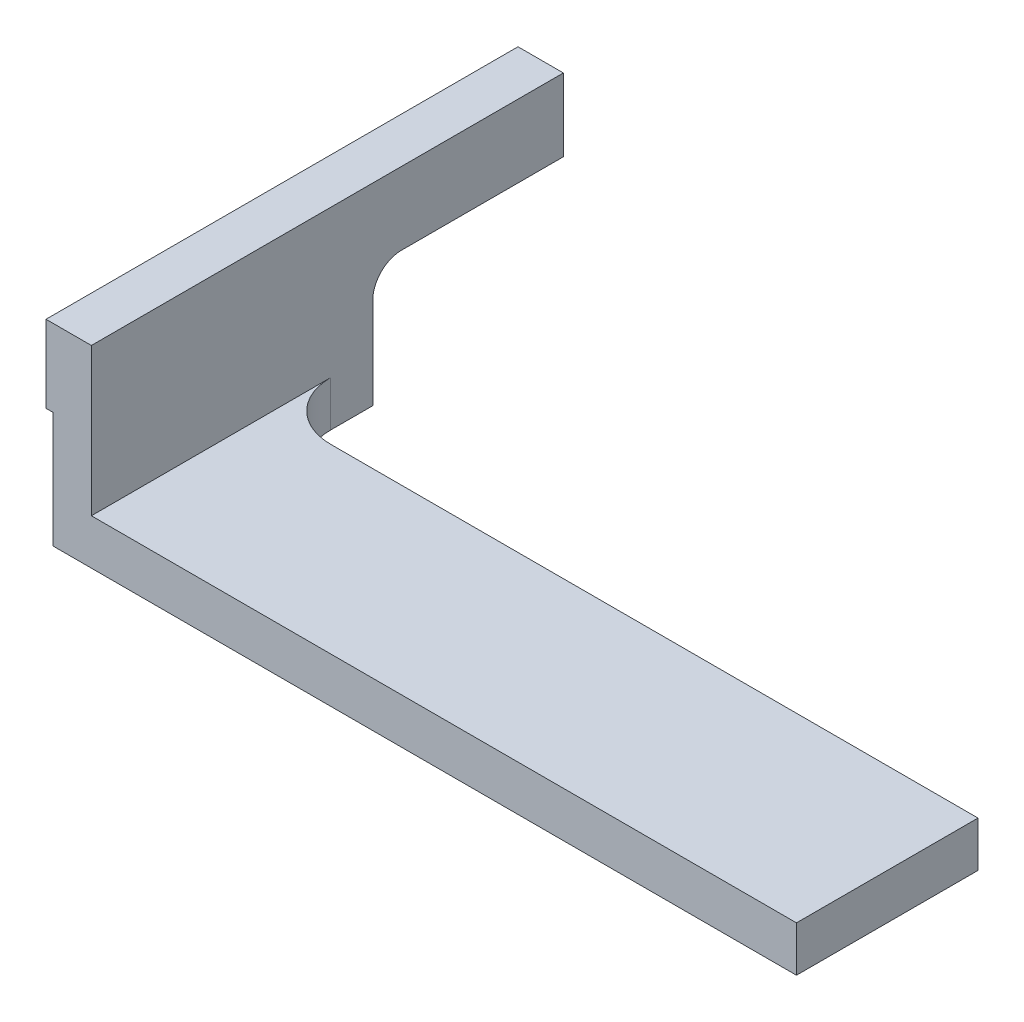
ISO-10303-21;
HEADER;
FILE_DESCRIPTION(('STEP AP214'),'2;1');
FILE_NAME('part.step','',(''),(''),'','','');
FILE_SCHEMA(('AUTOMOTIVE_DESIGN { 1 0 10303 214 1 1 1 1 }'));
ENDSEC;
DATA;
#1=APPLICATION_CONTEXT('core data for automotive mechanical design processes');
#2=APPLICATION_PROTOCOL_DEFINITION('international standard','automotive_design',2000,#1);
#3=PRODUCT_CONTEXT('',#1,'mechanical');
#4=PRODUCT('Part','Part','',(#3));
#5=PRODUCT_RELATED_PRODUCT_CATEGORY('part','',(#4));
#6=PRODUCT_DEFINITION_FORMATION('','',#4);
#7=PRODUCT_DEFINITION_CONTEXT('part definition',#1,'design');
#8=PRODUCT_DEFINITION('design','',#6,#7);
#9=PRODUCT_DEFINITION_SHAPE('','',#8);
#10=(LENGTH_UNIT() NAMED_UNIT(*) SI_UNIT(.MILLI.,.METRE.));
#11=(NAMED_UNIT(*) PLANE_ANGLE_UNIT() SI_UNIT($,.RADIAN.));
#12=(NAMED_UNIT(*) SI_UNIT($,.STERADIAN.) SOLID_ANGLE_UNIT());
#13=UNCERTAINTY_MEASURE_WITH_UNIT(LENGTH_MEASURE(1.E-05),#10,'distance_accuracy_value','');
#14=(GEOMETRIC_REPRESENTATION_CONTEXT(3) GLOBAL_UNCERTAINTY_ASSIGNED_CONTEXT((#13)) GLOBAL_UNIT_ASSIGNED_CONTEXT((#10,
#11,#12)) REPRESENTATION_CONTEXT('',''));
#15=CARTESIAN_POINT('',(0.,0.,0.));
#16=DIRECTION('',(0.,0.,1.));
#17=DIRECTION('',(1.,0.,0.));
#18=AXIS2_PLACEMENT_3D('',#15,#16,#17);
#19=CARTESIAN_POINT('',(82.68,0.,26.));
#20=DIRECTION('',(0.,1.,0.));
#21=DIRECTION('',(-1.,0.,0.));
#22=AXIS2_PLACEMENT_3D('',#19,#20,#21);
#23=PLANE('',#22);
#24=DIRECTION('',(0.,0.,1.));
#25=VECTOR('',#24,1.);
#26=CARTESIAN_POINT('',(0.75,0.,-26.));
#27=LINE('',#26,#25);
#28=CARTESIAN_POINT('',(0.75,0.,-5.));
#29=VERTEX_POINT('',#28);
#30=CARTESIAN_POINT('',(0.75,0.,26.));
#31=VERTEX_POINT('',#30);
#32=EDGE_CURVE('E210',#29,#31,#27,.T.);
#33=ORIENTED_EDGE('',*,*,#32,.F.);
#34=DIRECTION('',(1.,0.,0.));
#35=VECTOR('',#34,1.);
#36=CARTESIAN_POINT('',(0.,0.,-5.));
#37=LINE('',#36,#35);
#38=CARTESIAN_POINT('',(5.,0.,-5.));
#39=VERTEX_POINT('',#38);
#40=EDGE_CURVE('E201',#29,#39,#37,.T.);
#41=ORIENTED_EDGE('',*,*,#40,.T.);
#42=DIRECTION('',(0.,0.,1.));
#43=VECTOR('',#42,1.);
#44=CARTESIAN_POINT('',(5.,0.,6.00000000000001));
#45=LINE('',#44,#43);
#46=CARTESIAN_POINT('',(5.,0.,-0.349999999999993));
#47=VERTEX_POINT('',#46);
#48=EDGE_CURVE('E215',#39,#47,#45,.T.);
#49=ORIENTED_EDGE('',*,*,#48,.T.);
#50=CARTESIAN_POINT('',(11.35,0.,-0.349999999999993));
#51=DIRECTION('',(0.,1.,0.));
#52=DIRECTION('',(-1.,0.,0.));
#53=AXIS2_PLACEMENT_3D('',#50,#51,#52);
#54=CIRCLE('',#53,6.35);
#55=CARTESIAN_POINT('',(11.35,0.,6.00000000000001));
#56=VERTEX_POINT('',#55);
#57=EDGE_CURVE('E184',#47,#56,#54,.T.);
#58=ORIENTED_EDGE('',*,*,#57,.T.);
#59=DIRECTION('',(1.,0.,0.));
#60=VECTOR('',#59,1.);
#61=CARTESIAN_POINT('',(82.68,0.,6.));
#62=LINE('',#61,#60);
#63=CARTESIAN_POINT('',(82.68,0.,6.));
#64=VERTEX_POINT('',#63);
#65=EDGE_CURVE('E217',#56,#64,#62,.T.);
#66=ORIENTED_EDGE('',*,*,#65,.T.);
#67=DIRECTION('',(0.,0.,-1.));
#68=VECTOR('',#67,1.);
#69=CARTESIAN_POINT('',(82.68,0.,26.));
#70=LINE('',#69,#68);
#71=CARTESIAN_POINT('',(82.68,0.,26.));
#72=VERTEX_POINT('',#71);
#73=EDGE_CURVE('E174',#72,#64,#70,.T.);
#74=ORIENTED_EDGE('',*,*,#73,.F.);
#75=DIRECTION('',(1.,0.,0.));
#76=VECTOR('',#75,1.);
#77=CARTESIAN_POINT('',(82.68,0.,26.));
#78=LINE('',#77,#76);
#79=EDGE_CURVE('E157',#31,#72,#78,.T.);
#80=ORIENTED_EDGE('',*,*,#79,.F.);
#81=EDGE_LOOP('',(#33,#41,#49,#58,#66,#74,#80));
#82=FACE_BOUND('',#81,.T.);
#83=ADVANCED_FACE('F34',(#82),#23,.F.);
#84=CARTESIAN_POINT('',(82.68,5.,26.));
#85=DIRECTION('',(-1.,0.,0.));
#86=DIRECTION('',(0.,0.,1.));
#87=AXIS2_PLACEMENT_3D('',#84,#85,#86);
#88=PLANE('',#87);
#89=ORIENTED_EDGE('',*,*,#73,.T.);
#90=DIRECTION('',(0.,1.,0.));
#91=VECTOR('',#90,1.);
#92=CARTESIAN_POINT('',(82.68,0.,6.));
#93=LINE('',#92,#91);
#94=CARTESIAN_POINT('',(82.68,5.,6.));
#95=VERTEX_POINT('',#94);
#96=EDGE_CURVE('E219',#64,#95,#93,.T.);
#97=ORIENTED_EDGE('',*,*,#96,.T.);
#98=DIRECTION('',(0.,0.,-1.));
#99=VECTOR('',#98,1.);
#100=CARTESIAN_POINT('',(82.68,5.,26.));
#101=LINE('',#100,#99);
#102=CARTESIAN_POINT('',(82.68,5.,26.));
#103=VERTEX_POINT('',#102);
#104=EDGE_CURVE('E171',#103,#95,#101,.T.);
#105=ORIENTED_EDGE('',*,*,#104,.F.);
#106=DIRECTION('',(0.,1.,0.));
#107=VECTOR('',#106,1.);
#108=CARTESIAN_POINT('',(82.68,5.,26.));
#109=LINE('',#108,#107);
#110=EDGE_CURVE('E160',#72,#103,#109,.T.);
#111=ORIENTED_EDGE('',*,*,#110,.F.);
#112=EDGE_LOOP('',(#89,#97,#105,#111));
#113=FACE_BOUND('',#112,.T.);
#114=ADVANCED_FACE('F268',(#113),#88,.F.);
#115=CARTESIAN_POINT('',(5.,5.,26.));
#116=DIRECTION('',(0.,-1.,0.));
#117=DIRECTION('',(1.,0.,0.));
#118=AXIS2_PLACEMENT_3D('',#115,#116,#117);
#119=PLANE('',#118);
#120=ORIENTED_EDGE('',*,*,#104,.T.);
#121=DIRECTION('',(1.,0.,0.));
#122=VECTOR('',#121,1.);
#123=CARTESIAN_POINT('',(82.68,5.,6.));
#124=LINE('',#123,#122);
#125=CARTESIAN_POINT('',(11.35,5.,6.00000000000001));
#126=VERTEX_POINT('',#125);
#127=EDGE_CURVE('E212',#126,#95,#124,.T.);
#128=ORIENTED_EDGE('',*,*,#127,.F.);
#129=CARTESIAN_POINT('',(11.35,5.,-0.349999999999993));
#130=DIRECTION('',(0.,-1.,0.));
#131=DIRECTION('',(1.,0.,0.));
#132=AXIS2_PLACEMENT_3D('',#129,#130,#131);
#133=CIRCLE('',#132,6.35);
#134=CARTESIAN_POINT('',(5.,5.,-0.349999999999993));
#135=VERTEX_POINT('',#134);
#136=EDGE_CURVE('E182',#126,#135,#133,.T.);
#137=ORIENTED_EDGE('',*,*,#136,.T.);
#138=DIRECTION('',(0.,0.,-1.));
#139=VECTOR('',#138,1.);
#140=CARTESIAN_POINT('',(5.,5.,26.));
#141=LINE('',#140,#139);
#142=CARTESIAN_POINT('',(5.,5.,26.));
#143=VERTEX_POINT('',#142);
#144=EDGE_CURVE('E57',#143,#135,#141,.T.);
#145=ORIENTED_EDGE('',*,*,#144,.F.);
#146=DIRECTION('',(-1.,0.,0.));
#147=VECTOR('',#146,1.);
#148=CARTESIAN_POINT('',(5.,5.,26.));
#149=LINE('',#148,#147);
#150=EDGE_CURVE('E224',#103,#143,#149,.T.);
#151=ORIENTED_EDGE('',*,*,#150,.F.);
#152=EDGE_LOOP('',(#120,#128,#137,#145,#151));
#153=FACE_BOUND('',#152,.T.);
#154=ADVANCED_FACE('F246',(#153),#119,.F.);
#155=CARTESIAN_POINT('',(5.,21.25,26.));
#156=DIRECTION('',(-1.,0.,0.));
#157=DIRECTION('',(0.,-1.,0.));
#158=AXIS2_PLACEMENT_3D('',#155,#156,#157);
#159=PLANE('',#158);
#160=ORIENTED_EDGE('',*,*,#48,.F.);
#161=DIRECTION('',(0.,-1.,0.));
#162=VECTOR('',#161,1.);
#163=CARTESIAN_POINT('',(5.,0.,-5.));
#164=LINE('',#163,#162);
#165=CARTESIAN_POINT('',(5.,10.075,-5.));
#166=VERTEX_POINT('',#165);
#167=EDGE_CURVE('E142',#166,#39,#164,.T.);
#168=ORIENTED_EDGE('',*,*,#167,.F.);
#169=CARTESIAN_POINT('',(5.,10.075,-8.175));
#170=DIRECTION('',(1.,0.,0.));
#171=DIRECTION('',(0.,1.,0.));
#172=AXIS2_PLACEMENT_3D('',#169,#170,#171);
#173=CIRCLE('',#172,3.175);
#174=CARTESIAN_POINT('',(5.,13.25,-8.175));
#175=VERTEX_POINT('',#174);
#176=EDGE_CURVE('E258',#175,#166,#173,.T.);
#177=ORIENTED_EDGE('',*,*,#176,.F.);
#178=DIRECTION('',(0.,0.,1.));
#179=VECTOR('',#178,1.);
#180=CARTESIAN_POINT('',(5.,13.25,-26.));
#181=LINE('',#180,#179);
#182=CARTESIAN_POINT('',(5.,13.25,-26.));
#183=VERTEX_POINT('',#182);
#184=EDGE_CURVE('E236',#183,#175,#181,.T.);
#185=ORIENTED_EDGE('',*,*,#184,.F.);
#186=DIRECTION('',(0.,1.,0.));
#187=VECTOR('',#186,1.);
#188=CARTESIAN_POINT('',(5.,21.25,-26.));
#189=LINE('',#188,#187);
#190=CARTESIAN_POINT('',(5.,21.25,-26.));
#191=VERTEX_POINT('',#190);
#192=EDGE_CURVE('E150',#183,#191,#189,.T.);
#193=ORIENTED_EDGE('',*,*,#192,.T.);
#194=DIRECTION('',(0.,0.,-1.));
#195=VECTOR('',#194,1.);
#196=CARTESIAN_POINT('',(5.,21.25,26.));
#197=LINE('',#196,#195);
#198=CARTESIAN_POINT('',(5.,21.25,26.));
#199=VERTEX_POINT('',#198);
#200=EDGE_CURVE('E166',#199,#191,#197,.T.);
#201=ORIENTED_EDGE('',*,*,#200,.F.);
#202=DIRECTION('',(0.,1.,0.));
#203=VECTOR('',#202,1.);
#204=CARTESIAN_POINT('',(5.,21.25,26.));
#205=LINE('',#204,#203);
#206=EDGE_CURVE('E226',#143,#199,#205,.T.);
#207=ORIENTED_EDGE('',*,*,#206,.F.);
#208=ORIENTED_EDGE('',*,*,#144,.T.);
#209=DIRECTION('',(0.,1.,0.));
#210=VECTOR('',#209,1.);
#211=CARTESIAN_POINT('',(5.,0.,-0.349999999999993));
#212=LINE('',#211,#210);
#213=EDGE_CURVE('E180',#135,#47,#212,.F.);
#214=ORIENTED_EDGE('',*,*,#213,.T.);
#215=EDGE_LOOP('',(#160,#168,#177,#185,#193,#201,#207,#208,#214));
#216=FACE_BOUND('',#215,.T.);
#217=ADVANCED_FACE('F233',(#216),#159,.F.);
#218=CARTESIAN_POINT('',(0.,21.25,26.));
#219=DIRECTION('',(0.,-1.,0.));
#220=DIRECTION('',(0.,0.,-1.));
#221=AXIS2_PLACEMENT_3D('',#218,#219,#220);
#222=PLANE('',#221);
#223=DIRECTION('',(-1.,0.,0.));
#224=VECTOR('',#223,1.);
#225=CARTESIAN_POINT('',(0.,21.25,-26.));
#226=LINE('',#225,#224);
#227=CARTESIAN_POINT('',(0.,21.25,-26.));
#228=VERTEX_POINT('',#227);
#229=EDGE_CURVE('E158',#191,#228,#226,.T.);
#230=ORIENTED_EDGE('',*,*,#229,.T.);
#231=DIRECTION('',(0.,0.,-1.));
#232=VECTOR('',#231,1.);
#233=CARTESIAN_POINT('',(0.,21.25,26.));
#234=LINE('',#233,#232);
#235=CARTESIAN_POINT('',(0.,21.25,26.));
#236=VERTEX_POINT('',#235);
#237=EDGE_CURVE('E156',#236,#228,#234,.T.);
#238=ORIENTED_EDGE('',*,*,#237,.F.);
#239=DIRECTION('',(-1.,0.,0.));
#240=VECTOR('',#239,1.);
#241=CARTESIAN_POINT('',(0.,21.25,26.));
#242=LINE('',#241,#240);
#243=EDGE_CURVE('E228',#199,#236,#242,.T.);
#244=ORIENTED_EDGE('',*,*,#243,.F.);
#245=ORIENTED_EDGE('',*,*,#200,.T.);
#246=EDGE_LOOP('',(#230,#238,#244,#245));
#247=FACE_BOUND('',#246,.T.);
#248=ADVANCED_FACE('F238',(#247),#222,.F.);
#249=CARTESIAN_POINT('',(0.,0.,26.));
#250=DIRECTION('',(1.,0.,0.));
#251=DIRECTION('',(0.,0.,-1.));
#252=AXIS2_PLACEMENT_3D('',#249,#250,#251);
#253=PLANE('',#252);
#254=DIRECTION('',(0.,0.,1.));
#255=VECTOR('',#254,1.);
#256=CARTESIAN_POINT('',(0.,13.25,-26.));
#257=LINE('',#256,#255);
#258=CARTESIAN_POINT('',(0.,13.25,-26.));
#259=VERTEX_POINT('',#258);
#260=CARTESIAN_POINT('',(0.,13.25,-8.175));
#261=VERTEX_POINT('',#260);
#262=EDGE_CURVE('E130',#259,#261,#257,.T.);
#263=ORIENTED_EDGE('',*,*,#262,.T.);
#264=CARTESIAN_POINT('',(0.,10.075,-8.175));
#265=DIRECTION('',(1.,0.,0.));
#266=DIRECTION('',(0.,1.,0.));
#267=AXIS2_PLACEMENT_3D('',#264,#265,#266);
#268=CIRCLE('',#267,3.175);
#269=CARTESIAN_POINT('',(0.,12.75,-6.46473686235128));
#270=VERTEX_POINT('',#269);
#271=EDGE_CURVE('E141',#261,#270,#268,.T.);
#272=ORIENTED_EDGE('',*,*,#271,.T.);
#273=DIRECTION('',(0.,0.,1.));
#274=VECTOR('',#273,1.);
#275=CARTESIAN_POINT('',(0.,12.75,-26.));
#276=LINE('',#275,#274);
#277=CARTESIAN_POINT('',(0.,12.75,26.));
#278=VERTEX_POINT('',#277);
#279=EDGE_CURVE('E199',#270,#278,#276,.T.);
#280=ORIENTED_EDGE('',*,*,#279,.T.);
#281=DIRECTION('',(0.,-1.,0.));
#282=VECTOR('',#281,1.);
#283=CARTESIAN_POINT('',(0.,0.,26.));
#284=LINE('',#283,#282);
#285=EDGE_CURVE('E167',#236,#278,#284,.T.);
#286=ORIENTED_EDGE('',*,*,#285,.F.);
#287=ORIENTED_EDGE('',*,*,#237,.T.);
#288=DIRECTION('',(0.,-1.,0.));
#289=VECTOR('',#288,1.);
#290=CARTESIAN_POINT('',(0.,0.,-26.));
#291=LINE('',#290,#289);
#292=EDGE_CURVE('E149',#228,#259,#291,.T.);
#293=ORIENTED_EDGE('',*,*,#292,.T.);
#294=EDGE_LOOP('',(#263,#272,#280,#286,#287,#293));
#295=FACE_BOUND('',#294,.T.);
#296=ADVANCED_FACE('F153',(#295),#253,.F.);
#297=CARTESIAN_POINT('',(0.,0.,26.));
#298=DIRECTION('',(0.,0.,-1.));
#299=DIRECTION('',(-1.,0.,0.));
#300=AXIS2_PLACEMENT_3D('',#297,#298,#299);
#301=PLANE('',#300);
#302=ORIENTED_EDGE('',*,*,#285,.T.);
#303=DIRECTION('',(-1.,0.,0.));
#304=VECTOR('',#303,1.);
#305=CARTESIAN_POINT('',(0.,12.75,26.));
#306=LINE('',#305,#304);
#307=CARTESIAN_POINT('',(0.75,12.75,26.));
#308=VERTEX_POINT('',#307);
#309=EDGE_CURVE('E203',#308,#278,#306,.T.);
#310=ORIENTED_EDGE('',*,*,#309,.F.);
#311=DIRECTION('',(0.,1.,0.));
#312=VECTOR('',#311,1.);
#313=CARTESIAN_POINT('',(0.75,0.,26.));
#314=LINE('',#313,#312);
#315=EDGE_CURVE('E200',#31,#308,#314,.T.);
#316=ORIENTED_EDGE('',*,*,#315,.F.);
#317=ORIENTED_EDGE('',*,*,#79,.T.);
#318=ORIENTED_EDGE('',*,*,#110,.T.);
#319=ORIENTED_EDGE('',*,*,#150,.T.);
#320=ORIENTED_EDGE('',*,*,#206,.T.);
#321=ORIENTED_EDGE('',*,*,#243,.T.);
#322=EDGE_LOOP('',(#302,#310,#316,#317,#318,#319,#320,#321));
#323=FACE_BOUND('',#322,.T.);
#324=ADVANCED_FACE('F240',(#323),#301,.F.);
#325=CARTESIAN_POINT('',(0.,0.,-26.));
#326=DIRECTION('',(0.,0.,-1.));
#327=DIRECTION('',(-1.,0.,0.));
#328=AXIS2_PLACEMENT_3D('',#325,#326,#327);
#329=PLANE('',#328);
#330=DIRECTION('',(1.,0.,0.));
#331=VECTOR('',#330,1.);
#332=CARTESIAN_POINT('',(0.,13.25,-26.));
#333=LINE('',#332,#331);
#334=EDGE_CURVE('E134',#259,#183,#333,.T.);
#335=ORIENTED_EDGE('',*,*,#334,.F.);
#336=ORIENTED_EDGE('',*,*,#292,.F.);
#337=ORIENTED_EDGE('',*,*,#229,.F.);
#338=ORIENTED_EDGE('',*,*,#192,.F.);
#339=EDGE_LOOP('',(#335,#336,#337,#338));
#340=FACE_BOUND('',#339,.T.);
#341=ADVANCED_FACE('F147',(#340),#329,.T.);
#342=CARTESIAN_POINT('',(82.68,0.,6.));
#343=DIRECTION('',(0.,0.,1.));
#344=DIRECTION('',(1.,0.,0.));
#345=AXIS2_PLACEMENT_3D('',#342,#343,#344);
#346=PLANE('',#345);
#347=ORIENTED_EDGE('',*,*,#65,.F.);
#348=DIRECTION('',(0.,1.,0.));
#349=VECTOR('',#348,1.);
#350=CARTESIAN_POINT('',(11.35,5.,6.00000000000001));
#351=LINE('',#350,#349);
#352=EDGE_CURVE('E177',#56,#126,#351,.T.);
#353=ORIENTED_EDGE('',*,*,#352,.T.);
#354=ORIENTED_EDGE('',*,*,#127,.T.);
#355=ORIENTED_EDGE('',*,*,#96,.F.);
#356=EDGE_LOOP('',(#347,#353,#354,#355));
#357=FACE_BOUND('',#356,.T.);
#358=ADVANCED_FACE('F270',(#357),#346,.F.);
#359=CARTESIAN_POINT('',(11.35,0.,-0.349999999999993));
#360=DIRECTION('',(0.,-1.,0.));
#361=DIRECTION('',(1.,0.,0.));
#362=AXIS2_PLACEMENT_3D('',#359,#360,#361);
#363=CYLINDRICAL_SURFACE('',#362,6.35);
#364=ORIENTED_EDGE('',*,*,#57,.F.);
#365=ORIENTED_EDGE('',*,*,#213,.F.);
#366=ORIENTED_EDGE('',*,*,#136,.F.);
#367=ORIENTED_EDGE('',*,*,#352,.F.);
#368=EDGE_LOOP('',(#364,#365,#366,#367));
#369=FACE_BOUND('',#368,.T.);
#370=ADVANCED_FACE('F36',(#369),#363,.F.);
#371=CARTESIAN_POINT('',(0.,12.75,-26.));
#372=DIRECTION('',(0.,1.,0.));
#373=DIRECTION('',(0.,0.,1.));
#374=AXIS2_PLACEMENT_3D('',#371,#372,#373);
#375=PLANE('',#374);
#376=ORIENTED_EDGE('',*,*,#279,.F.);
#377=DIRECTION('',(1.,0.,0.));
#378=VECTOR('',#377,1.);
#379=CARTESIAN_POINT('',(0.,12.75,-6.46473686235128));
#380=LINE('',#379,#378);
#381=CARTESIAN_POINT('',(0.75,12.75,-6.46473686235128));
#382=VERTEX_POINT('',#381);
#383=EDGE_CURVE('E194',#270,#382,#380,.T.);
#384=ORIENTED_EDGE('',*,*,#383,.T.);
#385=DIRECTION('',(0.,0.,1.));
#386=VECTOR('',#385,1.);
#387=CARTESIAN_POINT('',(0.75,12.75,-26.));
#388=LINE('',#387,#386);
#389=EDGE_CURVE('E191',#382,#308,#388,.T.);
#390=ORIENTED_EDGE('',*,*,#389,.T.);
#391=ORIENTED_EDGE('',*,*,#309,.T.);
#392=EDGE_LOOP('',(#376,#384,#390,#391));
#393=FACE_BOUND('',#392,.T.);
#394=ADVANCED_FACE('F197',(#393),#375,.F.);
#395=CARTESIAN_POINT('',(0.75,0.,-26.));
#396=DIRECTION('',(1.,0.,0.));
#397=DIRECTION('',(0.,0.,-1.));
#398=AXIS2_PLACEMENT_3D('',#395,#396,#397);
#399=PLANE('',#398);
#400=CARTESIAN_POINT('',(0.75,10.075,-8.175));
#401=DIRECTION('',(1.,0.,0.));
#402=DIRECTION('',(0.,0.,-1.));
#403=AXIS2_PLACEMENT_3D('',#400,#401,#402);
#404=CIRCLE('',#403,3.175);
#405=CARTESIAN_POINT('',(0.75,10.075,-5.));
#406=VERTEX_POINT('',#405);
#407=EDGE_CURVE('E42',#382,#406,#404,.T.);
#408=ORIENTED_EDGE('',*,*,#407,.T.);
#409=DIRECTION('',(0.,-1.,0.));
#410=VECTOR('',#409,1.);
#411=CARTESIAN_POINT('',(0.75,0.,-5.));
#412=LINE('',#411,#410);
#413=EDGE_CURVE('E11',#406,#29,#412,.T.);
#414=ORIENTED_EDGE('',*,*,#413,.T.);
#415=ORIENTED_EDGE('',*,*,#32,.T.);
#416=ORIENTED_EDGE('',*,*,#315,.T.);
#417=ORIENTED_EDGE('',*,*,#389,.F.);
#418=EDGE_LOOP('',(#408,#414,#415,#416,#417));
#419=FACE_BOUND('',#418,.T.);
#420=ADVANCED_FACE('F188',(#419),#399,.F.);
#421=CARTESIAN_POINT('',(0.,0.,-5.));
#422=DIRECTION('',(0.,0.,1.));
#423=DIRECTION('',(1.,0.,0.));
#424=AXIS2_PLACEMENT_3D('',#421,#422,#423);
#425=PLANE('',#424);
#426=DIRECTION('',(1.,0.,0.));
#427=VECTOR('',#426,1.);
#428=CARTESIAN_POINT('',(0.,10.075,-5.));
#429=LINE('',#428,#427);
#430=EDGE_CURVE('E49',#406,#166,#429,.T.);
#431=ORIENTED_EDGE('',*,*,#430,.T.);
#432=ORIENTED_EDGE('',*,*,#167,.T.);
#433=ORIENTED_EDGE('',*,*,#40,.F.);
#434=ORIENTED_EDGE('',*,*,#413,.F.);
#435=EDGE_LOOP('',(#431,#432,#433,#434));
#436=FACE_BOUND('',#435,.T.);
#437=ADVANCED_FACE('F257',(#436),#425,.F.);
#438=CARTESIAN_POINT('',(0.,10.075,-8.175));
#439=DIRECTION('',(1.,0.,0.));
#440=DIRECTION('',(0.,1.,0.));
#441=AXIS2_PLACEMENT_3D('',#438,#439,#440);
#442=CYLINDRICAL_SURFACE('',#441,3.175);
#443=ORIENTED_EDGE('',*,*,#271,.F.);
#444=DIRECTION('',(1.,0.,0.));
#445=VECTOR('',#444,1.);
#446=CARTESIAN_POINT('',(0.,13.25,-8.175));
#447=LINE('',#446,#445);
#448=EDGE_CURVE('E136',#261,#175,#447,.T.);
#449=ORIENTED_EDGE('',*,*,#448,.T.);
#450=ORIENTED_EDGE('',*,*,#176,.T.);
#451=ORIENTED_EDGE('',*,*,#430,.F.);
#452=ORIENTED_EDGE('',*,*,#407,.F.);
#453=ORIENTED_EDGE('',*,*,#383,.F.);
#454=EDGE_LOOP('',(#443,#449,#450,#451,#452,#453));
#455=FACE_BOUND('',#454,.T.);
#456=ADVANCED_FACE('F193',(#455),#442,.F.);
#457=CARTESIAN_POINT('',(0.,13.25,-26.));
#458=DIRECTION('',(0.,1.,0.));
#459=DIRECTION('',(-1.,0.,0.));
#460=AXIS2_PLACEMENT_3D('',#457,#458,#459);
#461=PLANE('',#460);
#462=ORIENTED_EDGE('',*,*,#184,.T.);
#463=ORIENTED_EDGE('',*,*,#448,.F.);
#464=ORIENTED_EDGE('',*,*,#262,.F.);
#465=ORIENTED_EDGE('',*,*,#334,.T.);
#466=EDGE_LOOP('',(#462,#463,#464,#465));
#467=FACE_BOUND('',#466,.T.);
#468=ADVANCED_FACE('F133',(#467),#461,.F.);
#469=CLOSED_SHELL('',(#83,#114,#154,#217,#248,#296,#324,#341,#358,#370,#394,#420,#437,#456,#468));
#470=MANIFOLD_SOLID_BREP('B2',#469);
#471=ADVANCED_BREP_SHAPE_REPRESENTATION('',(#18,#470),#14);
#472=SHAPE_DEFINITION_REPRESENTATION(#9,#471);
ENDSEC;
END-ISO-10303-21;
